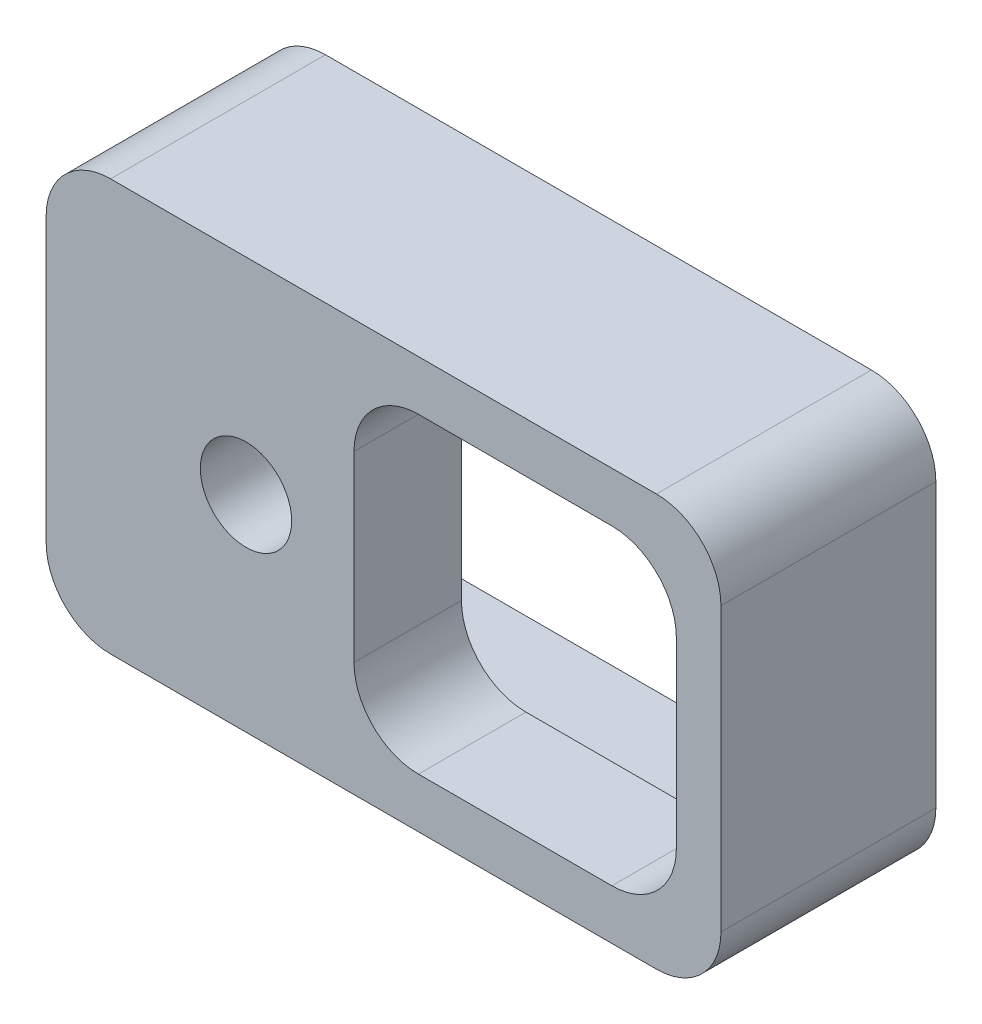
ISO-10303-21;
HEADER;
FILE_DESCRIPTION(('STEP AP214'),'2;1');
FILE_NAME('part.step','',(''),(''),'','','');
FILE_SCHEMA(('AUTOMOTIVE_DESIGN { 1 0 10303 214 1 1 1 1 }'));
ENDSEC;
DATA;
#1=APPLICATION_CONTEXT('core data for automotive mechanical design processes');
#2=APPLICATION_PROTOCOL_DEFINITION('international standard','automotive_design',2000,#1);
#3=PRODUCT_CONTEXT('',#1,'mechanical');
#4=PRODUCT('Part','Part','',(#3));
#5=PRODUCT_RELATED_PRODUCT_CATEGORY('part','',(#4));
#6=PRODUCT_DEFINITION_FORMATION('','',#4);
#7=PRODUCT_DEFINITION_CONTEXT('part definition',#1,'design');
#8=PRODUCT_DEFINITION('design','',#6,#7);
#9=PRODUCT_DEFINITION_SHAPE('','',#8);
#10=(LENGTH_UNIT() NAMED_UNIT(*) SI_UNIT(.MILLI.,.METRE.));
#11=(NAMED_UNIT(*) PLANE_ANGLE_UNIT() SI_UNIT($,.RADIAN.));
#12=(NAMED_UNIT(*) SI_UNIT($,.STERADIAN.) SOLID_ANGLE_UNIT());
#13=UNCERTAINTY_MEASURE_WITH_UNIT(LENGTH_MEASURE(1.E-05),#10,'distance_accuracy_value','');
#14=(GEOMETRIC_REPRESENTATION_CONTEXT(3) GLOBAL_UNCERTAINTY_ASSIGNED_CONTEXT((#13)) GLOBAL_UNIT_ASSIGNED_CONTEXT((#10,
#11,#12)) REPRESENTATION_CONTEXT('',''));
#15=CARTESIAN_POINT('',(0.,0.,0.));
#16=DIRECTION('',(0.,0.,1.));
#17=DIRECTION('',(1.,0.,0.));
#18=AXIS2_PLACEMENT_3D('',#15,#16,#17);
#19=CARTESIAN_POINT('',(0.,-2.25000000000001,10.));
#20=DIRECTION('',(0.,1.,0.));
#21=DIRECTION('',(0.,0.,1.));
#22=AXIS2_PLACEMENT_3D('',#19,#20,#21);
#23=PLANE('',#22);
#24=DIRECTION('',(1.,0.,0.));
#25=VECTOR('',#24,1.);
#26=CARTESIAN_POINT('',(0.,-2.25000000000001,10.));
#27=LINE('',#26,#25);
#28=CARTESIAN_POINT('',(32.25,-2.25000000000001,10.));
#29=VERTEX_POINT('',#28);
#30=CARTESIAN_POINT('',(50.25,-2.25000000000001,10.));
#31=VERTEX_POINT('',#30);
#32=EDGE_CURVE('E332',#29,#31,#27,.T.);
#33=ORIENTED_EDGE('',*,*,#32,.F.);
#34=DIRECTION('',(0.,0.,-1.));
#35=VECTOR('',#34,1.);
#36=CARTESIAN_POINT('',(32.25,-2.25000000000001,10.));
#37=LINE('',#36,#35);
#38=CARTESIAN_POINT('',(32.25,-2.25000000000001,0.));
#39=VERTEX_POINT('',#38);
#40=EDGE_CURVE('E313',#29,#39,#37,.T.);
#41=ORIENTED_EDGE('',*,*,#40,.T.);
#42=DIRECTION('',(1.,0.,0.));
#43=VECTOR('',#42,1.);
#44=CARTESIAN_POINT('',(0.,-2.25000000000001,0.));
#45=LINE('',#44,#43);
#46=CARTESIAN_POINT('',(50.25,-2.25000000000001,0.));
#47=VERTEX_POINT('',#46);
#48=EDGE_CURVE('E432',#39,#47,#45,.T.);
#49=ORIENTED_EDGE('',*,*,#48,.T.);
#50=DIRECTION('',(0.,0.,-1.));
#51=VECTOR('',#50,1.);
#52=CARTESIAN_POINT('',(50.25,-2.25000000000001,10.));
#53=LINE('',#52,#51);
#54=EDGE_CURVE('E311',#47,#31,#53,.F.);
#55=ORIENTED_EDGE('',*,*,#54,.T.);
#56=EDGE_LOOP('',(#33,#41,#49,#55));
#57=FACE_BOUND('',#56,.T.);
#58=ADVANCED_FACE('F38',(#57),#23,.F.);
#59=CARTESIAN_POINT('',(56.25,0.,10.));
#60=DIRECTION('',(1.,0.,0.));
#61=DIRECTION('',(0.,1.,0.));
#62=AXIS2_PLACEMENT_3D('',#59,#60,#61);
#63=PLANE('',#62);
#64=DIRECTION('',(0.,-1.,0.));
#65=VECTOR('',#64,1.);
#66=CARTESIAN_POINT('',(56.25,0.,0.));
#67=LINE('',#66,#65);
#68=CARTESIAN_POINT('',(56.25,-8.25,0.));
#69=VERTEX_POINT('',#68);
#70=CARTESIAN_POINT('',(56.25,-25.25,0.));
#71=VERTEX_POINT('',#70);
#72=EDGE_CURVE('E434',#69,#71,#67,.T.);
#73=ORIENTED_EDGE('',*,*,#72,.T.);
#74=DIRECTION('',(0.,0.,-1.));
#75=VECTOR('',#74,1.);
#76=CARTESIAN_POINT('',(56.25,-25.25,10.));
#77=LINE('',#76,#75);
#78=CARTESIAN_POINT('',(56.25,-25.25,10.));
#79=VERTEX_POINT('',#78);
#80=EDGE_CURVE('E304',#71,#79,#77,.F.);
#81=ORIENTED_EDGE('',*,*,#80,.T.);
#82=DIRECTION('',(0.,-1.,0.));
#83=VECTOR('',#82,1.);
#84=CARTESIAN_POINT('',(56.25,0.,10.));
#85=LINE('',#84,#83);
#86=CARTESIAN_POINT('',(56.25,-8.25,10.));
#87=VERTEX_POINT('',#86);
#88=EDGE_CURVE('E337',#87,#79,#85,.T.);
#89=ORIENTED_EDGE('',*,*,#88,.F.);
#90=DIRECTION('',(0.,0.,-1.));
#91=VECTOR('',#90,1.);
#92=CARTESIAN_POINT('',(56.25,-8.25,0.));
#93=LINE('',#92,#91);
#94=EDGE_CURVE('E301',#87,#69,#93,.T.);
#95=ORIENTED_EDGE('',*,*,#94,.T.);
#96=EDGE_LOOP('',(#73,#81,#89,#95));
#97=FACE_BOUND('',#96,.T.);
#98=ADVANCED_FACE('F352',(#97),#63,.F.);
#99=CARTESIAN_POINT('',(0.,-31.25,10.));
#100=DIRECTION('',(0.,1.,0.));
#101=DIRECTION('',(0.,0.,1.));
#102=AXIS2_PLACEMENT_3D('',#99,#100,#101);
#103=PLANE('',#102);
#104=DIRECTION('',(1.,0.,0.));
#105=VECTOR('',#104,1.);
#106=CARTESIAN_POINT('',(0.,-31.25,10.));
#107=LINE('',#106,#105);
#108=CARTESIAN_POINT('',(32.25,-31.25,10.));
#109=VERTEX_POINT('',#108);
#110=CARTESIAN_POINT('',(50.25,-31.25,10.));
#111=VERTEX_POINT('',#110);
#112=EDGE_CURVE('E421',#109,#111,#107,.T.);
#113=ORIENTED_EDGE('',*,*,#112,.T.);
#114=DIRECTION('',(0.,0.,-1.));
#115=VECTOR('',#114,1.);
#116=CARTESIAN_POINT('',(50.25,-31.25,10.));
#117=LINE('',#116,#115);
#118=CARTESIAN_POINT('',(50.25,-31.25,0.));
#119=VERTEX_POINT('',#118);
#120=EDGE_CURVE('E298',#111,#119,#117,.T.);
#121=ORIENTED_EDGE('',*,*,#120,.T.);
#122=DIRECTION('',(1.,0.,0.));
#123=VECTOR('',#122,1.);
#124=CARTESIAN_POINT('',(0.,-31.25,0.));
#125=LINE('',#124,#123);
#126=CARTESIAN_POINT('',(32.25,-31.25,0.));
#127=VERTEX_POINT('',#126);
#128=EDGE_CURVE('E438',#127,#119,#125,.T.);
#129=ORIENTED_EDGE('',*,*,#128,.F.);
#130=DIRECTION('',(0.,0.,-1.));
#131=VECTOR('',#130,1.);
#132=CARTESIAN_POINT('',(32.25,-31.25,10.));
#133=LINE('',#132,#131);
#134=EDGE_CURVE('E296',#127,#109,#133,.F.);
#135=ORIENTED_EDGE('',*,*,#134,.T.);
#136=EDGE_LOOP('',(#113,#121,#129,#135));
#137=FACE_BOUND('',#136,.T.);
#138=ADVANCED_FACE('F357',(#137),#103,.T.);
#139=CARTESIAN_POINT('',(60.4,0.,10.));
#140=DIRECTION('',(1.,0.,0.));
#141=DIRECTION('',(0.,1.,0.));
#142=AXIS2_PLACEMENT_3D('',#139,#140,#141);
#143=PLANE('',#142);
#144=DIRECTION('',(0.,-1.,0.));
#145=VECTOR('',#144,1.);
#146=CARTESIAN_POINT('',(60.4,0.,10.));
#147=LINE('',#146,#145);
#148=CARTESIAN_POINT('',(60.4,-3.6,10.));
#149=VERTEX_POINT('',#148);
#150=CARTESIAN_POINT('',(60.4,-29.9,10.));
#151=VERTEX_POINT('',#150);
#152=EDGE_CURVE('E441',#149,#151,#147,.T.);
#153=ORIENTED_EDGE('',*,*,#152,.T.);
#154=DIRECTION('',(0.,0.,-1.));
#155=VECTOR('',#154,1.);
#156=CARTESIAN_POINT('',(60.4,-29.9,-10.));
#157=LINE('',#156,#155);
#158=CARTESIAN_POINT('',(60.4,-29.9,-10.));
#159=VERTEX_POINT('',#158);
#160=EDGE_CURVE('E262',#151,#159,#157,.T.);
#161=ORIENTED_EDGE('',*,*,#160,.T.);
#162=DIRECTION('',(0.,-1.,0.));
#163=VECTOR('',#162,1.);
#164=CARTESIAN_POINT('',(60.4,0.,-10.));
#165=LINE('',#164,#163);
#166=CARTESIAN_POINT('',(60.4,-3.6,-10.));
#167=VERTEX_POINT('',#166);
#168=EDGE_CURVE('E466',#167,#159,#165,.T.);
#169=ORIENTED_EDGE('',*,*,#168,.F.);
#170=DIRECTION('',(0.,0.,-1.));
#171=VECTOR('',#170,1.);
#172=CARTESIAN_POINT('',(60.4,-3.6,10.));
#173=LINE('',#172,#171);
#174=EDGE_CURVE('E260',#167,#149,#173,.F.);
#175=ORIENTED_EDGE('',*,*,#174,.T.);
#176=EDGE_LOOP('',(#153,#161,#169,#175));
#177=FACE_BOUND('',#176,.T.);
#178=ADVANCED_FACE('F375',(#177),#143,.T.);
#179=CARTESIAN_POINT('',(0.,2.4,10.));
#180=DIRECTION('',(0.,1.,0.));
#181=DIRECTION('',(0.,0.,1.));
#182=AXIS2_PLACEMENT_3D('',#179,#180,#181);
#183=PLANE('',#182);
#184=DIRECTION('',(1.,0.,0.));
#185=VECTOR('',#184,1.);
#186=CARTESIAN_POINT('',(0.,2.4,-10.));
#187=LINE('',#186,#185);
#188=CARTESIAN_POINT('',(3.6,2.4,-10.));
#189=VERTEX_POINT('',#188);
#190=CARTESIAN_POINT('',(54.4,2.4,-10.));
#191=VERTEX_POINT('',#190);
#192=EDGE_CURVE('E474',#189,#191,#187,.T.);
#193=ORIENTED_EDGE('',*,*,#192,.F.);
#194=DIRECTION('',(0.,0.,-1.));
#195=VECTOR('',#194,1.);
#196=CARTESIAN_POINT('',(3.6,2.4,10.));
#197=LINE('',#196,#195);
#198=CARTESIAN_POINT('',(3.6,2.4,10.));
#199=VERTEX_POINT('',#198);
#200=EDGE_CURVE('E294',#189,#199,#197,.F.);
#201=ORIENTED_EDGE('',*,*,#200,.T.);
#202=DIRECTION('',(1.,0.,0.));
#203=VECTOR('',#202,1.);
#204=CARTESIAN_POINT('',(0.,2.4,10.));
#205=LINE('',#204,#203);
#206=CARTESIAN_POINT('',(54.4,2.4,10.));
#207=VERTEX_POINT('',#206);
#208=EDGE_CURVE('E444',#199,#207,#205,.T.);
#209=ORIENTED_EDGE('',*,*,#208,.T.);
#210=DIRECTION('',(0.,0.,-1.));
#211=VECTOR('',#210,1.);
#212=CARTESIAN_POINT('',(54.4,2.4,10.));
#213=LINE('',#212,#211);
#214=EDGE_CURVE('E291',#207,#191,#213,.T.);
#215=ORIENTED_EDGE('',*,*,#214,.T.);
#216=EDGE_LOOP('',(#193,#201,#209,#215));
#217=FACE_BOUND('',#216,.T.);
#218=ADVANCED_FACE('F371',(#217),#183,.T.);
#219=CARTESIAN_POINT('',(-2.4,0.,10.));
#220=DIRECTION('',(1.,0.,0.));
#221=DIRECTION('',(0.,1.,0.));
#222=AXIS2_PLACEMENT_3D('',#219,#220,#221);
#223=PLANE('',#222);
#224=DIRECTION('',(0.,-1.,0.));
#225=VECTOR('',#224,1.);
#226=CARTESIAN_POINT('',(-2.4,0.,-10.));
#227=LINE('',#226,#225);
#228=CARTESIAN_POINT('',(-2.4,-3.6,-10.));
#229=VERTEX_POINT('',#228);
#230=CARTESIAN_POINT('',(-2.4,-29.9,-10.));
#231=VERTEX_POINT('',#230);
#232=EDGE_CURVE('E476',#229,#231,#227,.T.);
#233=ORIENTED_EDGE('',*,*,#232,.T.);
#234=DIRECTION('',(0.,0.,-1.));
#235=VECTOR('',#234,1.);
#236=CARTESIAN_POINT('',(-2.4,-29.9,10.));
#237=LINE('',#236,#235);
#238=CARTESIAN_POINT('',(-2.4,-29.9,10.));
#239=VERTEX_POINT('',#238);
#240=EDGE_CURVE('E289',#231,#239,#237,.F.);
#241=ORIENTED_EDGE('',*,*,#240,.T.);
#242=DIRECTION('',(0.,-1.,0.));
#243=VECTOR('',#242,1.);
#244=CARTESIAN_POINT('',(-2.4,0.,10.));
#245=LINE('',#244,#243);
#246=CARTESIAN_POINT('',(-2.4,-3.6,10.));
#247=VERTEX_POINT('',#246);
#248=EDGE_CURVE('E449',#247,#239,#245,.T.);
#249=ORIENTED_EDGE('',*,*,#248,.F.);
#250=DIRECTION('',(0.,0.,-1.));
#251=VECTOR('',#250,1.);
#252=CARTESIAN_POINT('',(-2.4,-3.6,-10.));
#253=LINE('',#252,#251);
#254=EDGE_CURVE('E286',#247,#229,#253,.T.);
#255=ORIENTED_EDGE('',*,*,#254,.T.);
#256=EDGE_LOOP('',(#233,#241,#249,#255));
#257=FACE_BOUND('',#256,.T.);
#258=ADVANCED_FACE('F368',(#257),#223,.F.);
#259=CARTESIAN_POINT('',(26.25,0.,10.));
#260=DIRECTION('',(1.,0.,0.));
#261=DIRECTION('',(0.,1.,0.));
#262=AXIS2_PLACEMENT_3D('',#259,#260,#261);
#263=PLANE('',#262);
#264=DIRECTION('',(0.,-1.,0.));
#265=VECTOR('',#264,1.);
#266=CARTESIAN_POINT('',(26.25,0.,10.));
#267=LINE('',#266,#265);
#268=CARTESIAN_POINT('',(26.25,-8.25000000000001,10.));
#269=VERTEX_POINT('',#268);
#270=CARTESIAN_POINT('',(26.25,-25.25,10.));
#271=VERTEX_POINT('',#270);
#272=EDGE_CURVE('E228',#269,#271,#267,.T.);
#273=ORIENTED_EDGE('',*,*,#272,.T.);
#274=DIRECTION('',(0.,0.,-1.));
#275=VECTOR('',#274,1.);
#276=CARTESIAN_POINT('',(26.25,-25.25,0.));
#277=LINE('',#276,#275);
#278=CARTESIAN_POINT('',(26.25,-25.25,0.));
#279=VERTEX_POINT('',#278);
#280=EDGE_CURVE('E308',#271,#279,#277,.T.);
#281=ORIENTED_EDGE('',*,*,#280,.T.);
#282=DIRECTION('',(0.,-1.,0.));
#283=VECTOR('',#282,1.);
#284=CARTESIAN_POINT('',(26.25,0.,0.));
#285=LINE('',#284,#283);
#286=CARTESIAN_POINT('',(26.25,-8.25000000000001,0.));
#287=VERTEX_POINT('',#286);
#288=EDGE_CURVE('E439',#287,#279,#285,.T.);
#289=ORIENTED_EDGE('',*,*,#288,.F.);
#290=DIRECTION('',(0.,0.,-1.));
#291=VECTOR('',#290,1.);
#292=CARTESIAN_POINT('',(26.25,-8.25000000000001,10.));
#293=LINE('',#292,#291);
#294=EDGE_CURVE('E306',#287,#269,#293,.F.);
#295=ORIENTED_EDGE('',*,*,#294,.T.);
#296=EDGE_LOOP('',(#273,#281,#289,#295));
#297=FACE_BOUND('',#296,.T.);
#298=ADVANCED_FACE('F366',(#297),#263,.T.);
#299=CARTESIAN_POINT('',(0.,-35.9,10.));
#300=DIRECTION('',(0.,1.,0.));
#301=DIRECTION('',(0.,0.,1.));
#302=AXIS2_PLACEMENT_3D('',#299,#300,#301);
#303=PLANE('',#302);
#304=DIRECTION('',(1.,0.,0.));
#305=VECTOR('',#304,1.);
#306=CARTESIAN_POINT('',(0.,-35.9,-10.));
#307=LINE('',#306,#305);
#308=CARTESIAN_POINT('',(3.6,-35.9,-10.));
#309=VERTEX_POINT('',#308);
#310=CARTESIAN_POINT('',(54.4,-35.9,-10.));
#311=VERTEX_POINT('',#310);
#312=EDGE_CURVE('E485',#309,#311,#307,.T.);
#313=ORIENTED_EDGE('',*,*,#312,.T.);
#314=DIRECTION('',(0.,0.,-1.));
#315=VECTOR('',#314,1.);
#316=CARTESIAN_POINT('',(54.4,-35.9,10.));
#317=LINE('',#316,#315);
#318=CARTESIAN_POINT('',(54.4,-35.9,10.));
#319=VERTEX_POINT('',#318);
#320=EDGE_CURVE('E276',#311,#319,#317,.F.);
#321=ORIENTED_EDGE('',*,*,#320,.T.);
#322=DIRECTION('',(1.,0.,0.));
#323=VECTOR('',#322,1.);
#324=CARTESIAN_POINT('',(0.,-35.9,10.));
#325=LINE('',#324,#323);
#326=CARTESIAN_POINT('',(3.6,-35.9,10.));
#327=VERTEX_POINT('',#326);
#328=EDGE_CURVE('E338',#327,#319,#325,.T.);
#329=ORIENTED_EDGE('',*,*,#328,.F.);
#330=DIRECTION('',(0.,0.,-1.));
#331=VECTOR('',#330,1.);
#332=CARTESIAN_POINT('',(3.6,-35.9,10.));
#333=LINE('',#332,#331);
#334=EDGE_CURVE('E273',#327,#309,#333,.T.);
#335=ORIENTED_EDGE('',*,*,#334,.T.);
#336=EDGE_LOOP('',(#313,#321,#329,#335));
#337=FACE_BOUND('',#336,.T.);
#338=ADVANCED_FACE('F362',(#337),#303,.F.);
#339=CARTESIAN_POINT('',(16.2,-16.75,10.));
#340=DIRECTION('',(0.,0.,-1.));
#341=DIRECTION('',(-1.,0.,0.));
#342=AXIS2_PLACEMENT_3D('',#339,#340,#341);
#343=CYLINDRICAL_SURFACE('',#342,4.25);
#344=CARTESIAN_POINT('',(16.2,-16.75,3.));
#345=DIRECTION('',(0.,0.,1.));
#346=DIRECTION('',(1.,0.,0.));
#347=AXIS2_PLACEMENT_3D('',#344,#345,#346);
#348=CIRCLE('',#347,4.25);
#349=CARTESIAN_POINT('',(20.45,-16.75,3.));
#350=VERTEX_POINT('',#349);
#351=EDGE_CURVE('E231',#350,#350,#348,.T.);
#352=ORIENTED_EDGE('',*,*,#351,.F.);
#353=EDGE_LOOP('',(#352));
#354=FACE_BOUND('',#353,.T.);
#355=CARTESIAN_POINT('',(16.2,-16.75,10.));
#356=DIRECTION('',(0.,0.,1.));
#357=DIRECTION('',(1.,0.,0.));
#358=AXIS2_PLACEMENT_3D('',#355,#356,#357);
#359=CIRCLE('',#358,4.25);
#360=CARTESIAN_POINT('',(20.45,-16.75,10.));
#361=VERTEX_POINT('',#360);
#362=EDGE_CURVE('E224',#361,#361,#359,.T.);
#363=ORIENTED_EDGE('',*,*,#362,.T.);
#364=EDGE_LOOP('',(#363));
#365=FACE_BOUND('',#364,.T.);
#366=ADVANCED_FACE('F365',(#354,#365),#343,.F.);
#367=CARTESIAN_POINT('',(0.,0.,10.));
#368=DIRECTION('',(0.,0.,1.));
#369=DIRECTION('',(1.,0.,0.));
#370=AXIS2_PLACEMENT_3D('',#367,#368,#369);
#371=PLANE('',#370);
#372=ORIENTED_EDGE('',*,*,#328,.T.);
#373=CARTESIAN_POINT('',(54.4,-29.9,10.));
#374=DIRECTION('',(0.,0.,1.));
#375=DIRECTION('',(1.,0.,0.));
#376=AXIS2_PLACEMENT_3D('',#373,#374,#375);
#377=CIRCLE('',#376,6.);
#378=EDGE_CURVE('E284',#319,#151,#377,.T.);
#379=ORIENTED_EDGE('',*,*,#378,.T.);
#380=ORIENTED_EDGE('',*,*,#152,.F.);
#381=CARTESIAN_POINT('',(54.4,-3.6,10.));
#382=DIRECTION('',(0.,0.,1.));
#383=DIRECTION('',(1.,0.,0.));
#384=AXIS2_PLACEMENT_3D('',#381,#382,#383);
#385=CIRCLE('',#384,6.);
#386=EDGE_CURVE('E278',#149,#207,#385,.T.);
#387=ORIENTED_EDGE('',*,*,#386,.T.);
#388=ORIENTED_EDGE('',*,*,#208,.F.);
#389=CARTESIAN_POINT('',(3.6,-3.6,10.));
#390=DIRECTION('',(0.,0.,1.));
#391=DIRECTION('',(1.,0.,0.));
#392=AXIS2_PLACEMENT_3D('',#389,#390,#391);
#393=CIRCLE('',#392,6.);
#394=EDGE_CURVE('E280',#199,#247,#393,.T.);
#395=ORIENTED_EDGE('',*,*,#394,.T.);
#396=ORIENTED_EDGE('',*,*,#248,.T.);
#397=CARTESIAN_POINT('',(3.6,-29.9,10.));
#398=DIRECTION('',(0.,0.,1.));
#399=DIRECTION('',(1.,0.,0.));
#400=AXIS2_PLACEMENT_3D('',#397,#398,#399);
#401=CIRCLE('',#400,6.);
#402=EDGE_CURVE('E282',#239,#327,#401,.T.);
#403=ORIENTED_EDGE('',*,*,#402,.T.);
#404=EDGE_LOOP('',(#372,#379,#380,#387,#388,#395,#396,#403));
#405=FACE_BOUND('',#404,.T.);
#406=ORIENTED_EDGE('',*,*,#272,.F.);
#407=CARTESIAN_POINT('',(32.25,-8.25000000000001,10.));
#408=DIRECTION('',(0.,0.,1.));
#409=DIRECTION('',(1.,0.,0.));
#410=AXIS2_PLACEMENT_3D('',#407,#408,#409);
#411=CIRCLE('',#410,6.);
#412=EDGE_CURVE('E324',#269,#29,#411,.F.);
#413=ORIENTED_EDGE('',*,*,#412,.T.);
#414=ORIENTED_EDGE('',*,*,#32,.T.);
#415=CARTESIAN_POINT('',(50.25,-8.25000000000001,10.));
#416=DIRECTION('',(0.,0.,1.));
#417=DIRECTION('',(1.,0.,0.));
#418=AXIS2_PLACEMENT_3D('',#415,#416,#417);
#419=CIRCLE('',#418,6.);
#420=EDGE_CURVE('E11',#31,#87,#419,.F.);
#421=ORIENTED_EDGE('',*,*,#420,.T.);
#422=ORIENTED_EDGE('',*,*,#88,.T.);
#423=CARTESIAN_POINT('',(50.25,-25.25,10.));
#424=DIRECTION('',(0.,0.,1.));
#425=DIRECTION('',(1.,0.,0.));
#426=AXIS2_PLACEMENT_3D('',#423,#424,#425);
#427=CIRCLE('',#426,6.);
#428=EDGE_CURVE('E317',#79,#111,#427,.F.);
#429=ORIENTED_EDGE('',*,*,#428,.T.);
#430=ORIENTED_EDGE('',*,*,#112,.F.);
#431=CARTESIAN_POINT('',(32.25,-25.25,10.));
#432=DIRECTION('',(0.,0.,1.));
#433=DIRECTION('',(1.,0.,0.));
#434=AXIS2_PLACEMENT_3D('',#431,#432,#433);
#435=CIRCLE('',#434,6.);
#436=EDGE_CURVE('E321',#109,#271,#435,.F.);
#437=ORIENTED_EDGE('',*,*,#436,.T.);
#438=EDGE_LOOP('',(#406,#413,#414,#421,#422,#429,#430,#437));
#439=FACE_BOUND('',#438,.T.);
#440=ORIENTED_EDGE('',*,*,#362,.F.);
#441=EDGE_LOOP('',(#440));
#442=FACE_BOUND('',#441,.T.);
#443=ADVANCED_FACE('F330',(#405,#439,#442),#371,.T.);
#444=CARTESIAN_POINT('',(0.,0.,0.));
#445=DIRECTION('',(0.,0.,1.));
#446=DIRECTION('',(1.,0.,0.));
#447=AXIS2_PLACEMENT_3D('',#444,#445,#446);
#448=PLANE('',#447);
#449=CARTESIAN_POINT('',(14.45,-16.75,0.));
#450=DIRECTION('',(0.,0.,1.));
#451=DIRECTION('',(1.,0.,0.));
#452=AXIS2_PLACEMENT_3D('',#449,#450,#451);
#453=CIRCLE('',#452,6.5);
#454=CARTESIAN_POINT('',(20.95,-16.75,0.));
#455=VERTEX_POINT('',#454);
#456=EDGE_CURVE('E480',#455,#455,#453,.T.);
#457=ORIENTED_EDGE('',*,*,#456,.T.);
#458=EDGE_LOOP('',(#457));
#459=FACE_BOUND('',#458,.T.);
#460=DIRECTION('',(0.,-1.,0.));
#461=VECTOR('',#460,1.);
#462=CARTESIAN_POINT('',(58.,0.,0.));
#463=LINE('',#462,#461);
#464=CARTESIAN_POINT('',(58.,-3.6,0.));
#465=VERTEX_POINT('',#464);
#466=CARTESIAN_POINT('',(58.,-29.9,0.));
#467=VERTEX_POINT('',#466);
#468=EDGE_CURVE('E202',#465,#467,#463,.T.);
#469=ORIENTED_EDGE('',*,*,#468,.T.);
#470=CARTESIAN_POINT('',(54.4,-29.9,0.));
#471=DIRECTION('',(0.,0.,1.));
#472=DIRECTION('',(1.,0.,0.));
#473=AXIS2_PLACEMENT_3D('',#470,#471,#472);
#474=CIRCLE('',#473,3.6);
#475=CARTESIAN_POINT('',(54.4,-33.5,0.));
#476=VERTEX_POINT('',#475);
#477=EDGE_CURVE('E237',#467,#476,#474,.F.);
#478=ORIENTED_EDGE('',*,*,#477,.T.);
#479=DIRECTION('',(1.,0.,0.));
#480=VECTOR('',#479,1.);
#481=CARTESIAN_POINT('',(0.,-33.5,0.));
#482=LINE('',#481,#480);
#483=CARTESIAN_POINT('',(3.6,-33.5,0.));
#484=VERTEX_POINT('',#483);
#485=EDGE_CURVE('E219',#484,#476,#482,.T.);
#486=ORIENTED_EDGE('',*,*,#485,.F.);
#487=CARTESIAN_POINT('',(3.6,-29.9,0.));
#488=DIRECTION('',(0.,0.,1.));
#489=DIRECTION('',(1.,0.,0.));
#490=AXIS2_PLACEMENT_3D('',#487,#488,#489);
#491=CIRCLE('',#490,3.6);
#492=CARTESIAN_POINT('',(0.,-29.9,0.));
#493=VERTEX_POINT('',#492);
#494=EDGE_CURVE('E235',#484,#493,#491,.F.);
#495=ORIENTED_EDGE('',*,*,#494,.T.);
#496=DIRECTION('',(0.,-1.,0.));
#497=VECTOR('',#496,1.);
#498=CARTESIAN_POINT('',(0.,0.,0.));
#499=LINE('',#498,#497);
#500=CARTESIAN_POINT('',(0.,-3.6,0.));
#501=VERTEX_POINT('',#500);
#502=EDGE_CURVE('E452',#501,#493,#499,.T.);
#503=ORIENTED_EDGE('',*,*,#502,.F.);
#504=CARTESIAN_POINT('',(3.6,-3.6,0.));
#505=DIRECTION('',(0.,0.,1.));
#506=DIRECTION('',(1.,0.,0.));
#507=AXIS2_PLACEMENT_3D('',#504,#505,#506);
#508=CIRCLE('',#507,3.6);
#509=CARTESIAN_POINT('',(3.6,0.,0.));
#510=VERTEX_POINT('',#509);
#511=EDGE_CURVE('E209',#501,#510,#508,.F.);
#512=ORIENTED_EDGE('',*,*,#511,.T.);
#513=DIRECTION('',(1.,0.,0.));
#514=VECTOR('',#513,1.);
#515=CARTESIAN_POINT('',(0.,0.,0.));
#516=LINE('',#515,#514);
#517=CARTESIAN_POINT('',(54.4,0.,0.));
#518=VERTEX_POINT('',#517);
#519=EDGE_CURVE('E204',#510,#518,#516,.T.);
#520=ORIENTED_EDGE('',*,*,#519,.T.);
#521=CARTESIAN_POINT('',(54.4,-3.6,0.));
#522=DIRECTION('',(0.,0.,1.));
#523=DIRECTION('',(1.,0.,0.));
#524=AXIS2_PLACEMENT_3D('',#521,#522,#523);
#525=CIRCLE('',#524,3.6);
#526=EDGE_CURVE('E199',#518,#465,#525,.F.);
#527=ORIENTED_EDGE('',*,*,#526,.T.);
#528=EDGE_LOOP('',(#469,#478,#486,#495,#503,#512,#520,#527));
#529=FACE_BOUND('',#528,.T.);
#530=ORIENTED_EDGE('',*,*,#48,.F.);
#531=CARTESIAN_POINT('',(32.25,-8.25000000000001,0.));
#532=DIRECTION('',(0.,0.,1.));
#533=DIRECTION('',(1.,0.,0.));
#534=AXIS2_PLACEMENT_3D('',#531,#532,#533);
#535=CIRCLE('',#534,6.);
#536=EDGE_CURVE('E60',#39,#287,#535,.T.);
#537=ORIENTED_EDGE('',*,*,#536,.T.);
#538=ORIENTED_EDGE('',*,*,#288,.T.);
#539=CARTESIAN_POINT('',(32.25,-25.25,0.));
#540=DIRECTION('',(0.,0.,1.));
#541=DIRECTION('',(1.,0.,0.));
#542=AXIS2_PLACEMENT_3D('',#539,#540,#541);
#543=CIRCLE('',#542,6.);
#544=EDGE_CURVE('E319',#279,#127,#543,.T.);
#545=ORIENTED_EDGE('',*,*,#544,.T.);
#546=ORIENTED_EDGE('',*,*,#128,.T.);
#547=CARTESIAN_POINT('',(50.25,-25.25,0.));
#548=DIRECTION('',(0.,0.,1.));
#549=DIRECTION('',(1.,0.,0.));
#550=AXIS2_PLACEMENT_3D('',#547,#548,#549);
#551=CIRCLE('',#550,6.);
#552=EDGE_CURVE('E315',#119,#71,#551,.T.);
#553=ORIENTED_EDGE('',*,*,#552,.T.);
#554=ORIENTED_EDGE('',*,*,#72,.F.);
#555=CARTESIAN_POINT('',(50.25,-8.25000000000001,0.));
#556=DIRECTION('',(0.,0.,1.));
#557=DIRECTION('',(1.,0.,0.));
#558=AXIS2_PLACEMENT_3D('',#555,#556,#557);
#559=CIRCLE('',#558,6.);
#560=EDGE_CURVE('E46',#69,#47,#559,.T.);
#561=ORIENTED_EDGE('',*,*,#560,.T.);
#562=EDGE_LOOP('',(#530,#537,#538,#545,#546,#553,#554,#561));
#563=FACE_BOUND('',#562,.T.);
#564=ADVANCED_FACE('F201',(#459,#529,#563),#448,.F.);
#565=CARTESIAN_POINT('',(0.,0.,-10.));
#566=DIRECTION('',(0.,-1.,0.));
#567=DIRECTION('',(0.,0.,-1.));
#568=AXIS2_PLACEMENT_3D('',#565,#566,#567);
#569=PLANE('',#568);
#570=ORIENTED_EDGE('',*,*,#519,.F.);
#571=DIRECTION('',(0.,0.,1.));
#572=VECTOR('',#571,1.);
#573=CARTESIAN_POINT('',(3.6,0.,-10.));
#574=LINE('',#573,#572);
#575=CARTESIAN_POINT('',(3.6,0.,-10.));
#576=VERTEX_POINT('',#575);
#577=EDGE_CURVE('E251',#510,#576,#574,.F.);
#578=ORIENTED_EDGE('',*,*,#577,.T.);
#579=DIRECTION('',(1.,0.,0.));
#580=VECTOR('',#579,1.);
#581=CARTESIAN_POINT('',(0.,0.,-10.));
#582=LINE('',#581,#580);
#583=CARTESIAN_POINT('',(54.4,0.,-10.));
#584=VERTEX_POINT('',#583);
#585=EDGE_CURVE('E487',#576,#584,#582,.T.);
#586=ORIENTED_EDGE('',*,*,#585,.T.);
#587=DIRECTION('',(0.,0.,1.));
#588=VECTOR('',#587,1.);
#589=CARTESIAN_POINT('',(54.4,0.,0.));
#590=LINE('',#589,#588);
#591=EDGE_CURVE('E249',#584,#518,#590,.T.);
#592=ORIENTED_EDGE('',*,*,#591,.T.);
#593=EDGE_LOOP('',(#570,#578,#586,#592));
#594=FACE_BOUND('',#593,.T.);
#595=ADVANCED_FACE('F516',(#594),#569,.T.);
#596=CARTESIAN_POINT('',(0.,0.,-10.));
#597=DIRECTION('',(-1.,0.,0.));
#598=DIRECTION('',(0.,-1.,0.));
#599=AXIS2_PLACEMENT_3D('',#596,#597,#598);
#600=PLANE('',#599);
#601=ORIENTED_EDGE('',*,*,#502,.T.);
#602=DIRECTION('',(0.,0.,1.));
#603=VECTOR('',#602,1.);
#604=CARTESIAN_POINT('',(0.,-29.9,-10.));
#605=LINE('',#604,#603);
#606=CARTESIAN_POINT('',(0.,-29.9,-10.));
#607=VERTEX_POINT('',#606);
#608=EDGE_CURVE('E247',#493,#607,#605,.F.);
#609=ORIENTED_EDGE('',*,*,#608,.T.);
#610=DIRECTION('',(0.,-1.,0.));
#611=VECTOR('',#610,1.);
#612=CARTESIAN_POINT('',(0.,0.,-10.));
#613=LINE('',#612,#611);
#614=CARTESIAN_POINT('',(0.,-3.6,-10.));
#615=VERTEX_POINT('',#614);
#616=EDGE_CURVE('E435',#615,#607,#613,.T.);
#617=ORIENTED_EDGE('',*,*,#616,.F.);
#618=DIRECTION('',(0.,0.,1.));
#619=VECTOR('',#618,1.);
#620=CARTESIAN_POINT('',(0.,-3.6,-10.));
#621=LINE('',#620,#619);
#622=EDGE_CURVE('E244',#615,#501,#621,.T.);
#623=ORIENTED_EDGE('',*,*,#622,.T.);
#624=EDGE_LOOP('',(#601,#609,#617,#623));
#625=FACE_BOUND('',#624,.T.);
#626=ADVANCED_FACE('F510',(#625),#600,.F.);
#627=CARTESIAN_POINT('',(0.,-33.5,-10.));
#628=DIRECTION('',(0.,-1.,0.));
#629=DIRECTION('',(0.,0.,-1.));
#630=AXIS2_PLACEMENT_3D('',#627,#628,#629);
#631=PLANE('',#630);
#632=ORIENTED_EDGE('',*,*,#485,.T.);
#633=DIRECTION('',(0.,0.,1.));
#634=VECTOR('',#633,1.);
#635=CARTESIAN_POINT('',(54.4,-33.5,-10.));
#636=LINE('',#635,#634);
#637=CARTESIAN_POINT('',(54.4,-33.5,-10.));
#638=VERTEX_POINT('',#637);
#639=EDGE_CURVE('E242',#476,#638,#636,.F.);
#640=ORIENTED_EDGE('',*,*,#639,.T.);
#641=DIRECTION('',(1.,0.,0.));
#642=VECTOR('',#641,1.);
#643=CARTESIAN_POINT('',(0.,-33.5,-10.));
#644=LINE('',#643,#642);
#645=CARTESIAN_POINT('',(3.6,-33.5,-10.));
#646=VERTEX_POINT('',#645);
#647=EDGE_CURVE('E492',#646,#638,#644,.T.);
#648=ORIENTED_EDGE('',*,*,#647,.F.);
#649=DIRECTION('',(0.,0.,1.));
#650=VECTOR('',#649,1.);
#651=CARTESIAN_POINT('',(3.6,-33.5,0.));
#652=LINE('',#651,#650);
#653=EDGE_CURVE('E239',#646,#484,#652,.T.);
#654=ORIENTED_EDGE('',*,*,#653,.T.);
#655=EDGE_LOOP('',(#632,#640,#648,#654));
#656=FACE_BOUND('',#655,.T.);
#657=ADVANCED_FACE('F501',(#656),#631,.F.);
#658=CARTESIAN_POINT('',(58.,0.,-10.));
#659=DIRECTION('',(-1.,0.,0.));
#660=DIRECTION('',(0.,-1.,0.));
#661=AXIS2_PLACEMENT_3D('',#658,#659,#660);
#662=PLANE('',#661);
#663=DIRECTION('',(0.,-1.,0.));
#664=VECTOR('',#663,1.);
#665=CARTESIAN_POINT('',(58.,0.,-10.));
#666=LINE('',#665,#664);
#667=CARTESIAN_POINT('',(58.,-3.6,-10.));
#668=VERTEX_POINT('',#667);
#669=CARTESIAN_POINT('',(58.,-29.9,-10.));
#670=VERTEX_POINT('',#669);
#671=EDGE_CURVE('E490',#668,#670,#666,.T.);
#672=ORIENTED_EDGE('',*,*,#671,.T.);
#673=DIRECTION('',(0.,0.,1.));
#674=VECTOR('',#673,1.);
#675=CARTESIAN_POINT('',(58.,-29.9,-10.));
#676=LINE('',#675,#674);
#677=EDGE_CURVE('E210',#670,#467,#676,.T.);
#678=ORIENTED_EDGE('',*,*,#677,.T.);
#679=ORIENTED_EDGE('',*,*,#468,.F.);
#680=DIRECTION('',(0.,0.,1.));
#681=VECTOR('',#680,1.);
#682=CARTESIAN_POINT('',(58.,-3.6,-10.));
#683=LINE('',#682,#681);
#684=EDGE_CURVE('E216',#465,#668,#683,.F.);
#685=ORIENTED_EDGE('',*,*,#684,.T.);
#686=EDGE_LOOP('',(#672,#678,#679,#685));
#687=FACE_BOUND('',#686,.T.);
#688=ADVANCED_FACE('F215',(#687),#662,.T.);
#689=CARTESIAN_POINT('',(0.,0.,-10.));
#690=DIRECTION('',(0.,0.,1.));
#691=DIRECTION('',(1.,0.,0.));
#692=AXIS2_PLACEMENT_3D('',#689,#690,#691);
#693=PLANE('',#692);
#694=ORIENTED_EDGE('',*,*,#168,.T.);
#695=CARTESIAN_POINT('',(54.4,-29.9,-10.));
#696=DIRECTION('',(0.,0.,1.));
#697=DIRECTION('',(1.,0.,0.));
#698=AXIS2_PLACEMENT_3D('',#695,#696,#697);
#699=CIRCLE('',#698,6.);
#700=EDGE_CURVE('E271',#159,#311,#699,.F.);
#701=ORIENTED_EDGE('',*,*,#700,.T.);
#702=ORIENTED_EDGE('',*,*,#312,.F.);
#703=CARTESIAN_POINT('',(3.6,-29.9,-10.));
#704=DIRECTION('',(0.,0.,1.));
#705=DIRECTION('',(1.,0.,0.));
#706=AXIS2_PLACEMENT_3D('',#703,#704,#705);
#707=CIRCLE('',#706,6.);
#708=EDGE_CURVE('E269',#309,#231,#707,.F.);
#709=ORIENTED_EDGE('',*,*,#708,.T.);
#710=ORIENTED_EDGE('',*,*,#232,.F.);
#711=CARTESIAN_POINT('',(3.6,-3.6,-10.));
#712=DIRECTION('',(0.,0.,1.));
#713=DIRECTION('',(1.,0.,0.));
#714=AXIS2_PLACEMENT_3D('',#711,#712,#713);
#715=CIRCLE('',#714,6.);
#716=EDGE_CURVE('E267',#229,#189,#715,.F.);
#717=ORIENTED_EDGE('',*,*,#716,.T.);
#718=ORIENTED_EDGE('',*,*,#192,.T.);
#719=CARTESIAN_POINT('',(54.4,-3.6,-10.));
#720=DIRECTION('',(0.,0.,1.));
#721=DIRECTION('',(1.,0.,0.));
#722=AXIS2_PLACEMENT_3D('',#719,#720,#721);
#723=CIRCLE('',#722,6.);
#724=EDGE_CURVE('E265',#191,#167,#723,.F.);
#725=ORIENTED_EDGE('',*,*,#724,.T.);
#726=EDGE_LOOP('',(#694,#701,#702,#709,#710,#717,#718,#725));
#727=FACE_BOUND('',#726,.T.);
#728=ORIENTED_EDGE('',*,*,#585,.F.);
#729=CARTESIAN_POINT('',(3.6,-3.6,-10.));
#730=DIRECTION('',(0.,0.,1.));
#731=DIRECTION('',(1.,0.,0.));
#732=AXIS2_PLACEMENT_3D('',#729,#730,#731);
#733=CIRCLE('',#732,3.6);
#734=EDGE_CURVE('E257',#576,#615,#733,.T.);
#735=ORIENTED_EDGE('',*,*,#734,.T.);
#736=ORIENTED_EDGE('',*,*,#616,.T.);
#737=CARTESIAN_POINT('',(3.6,-29.9,-10.));
#738=DIRECTION('',(0.,0.,1.));
#739=DIRECTION('',(1.,0.,0.));
#740=AXIS2_PLACEMENT_3D('',#737,#738,#739);
#741=CIRCLE('',#740,3.6);
#742=EDGE_CURVE('E255',#607,#646,#741,.T.);
#743=ORIENTED_EDGE('',*,*,#742,.T.);
#744=ORIENTED_EDGE('',*,*,#647,.T.);
#745=CARTESIAN_POINT('',(54.4,-29.9,-10.));
#746=DIRECTION('',(0.,0.,1.));
#747=DIRECTION('',(1.,0.,0.));
#748=AXIS2_PLACEMENT_3D('',#745,#746,#747);
#749=CIRCLE('',#748,3.6);
#750=EDGE_CURVE('E253',#638,#670,#749,.T.);
#751=ORIENTED_EDGE('',*,*,#750,.T.);
#752=ORIENTED_EDGE('',*,*,#671,.F.);
#753=CARTESIAN_POINT('',(54.4,-3.6,-10.));
#754=DIRECTION('',(0.,0.,1.));
#755=DIRECTION('',(1.,0.,0.));
#756=AXIS2_PLACEMENT_3D('',#753,#754,#755);
#757=CIRCLE('',#756,3.6);
#758=EDGE_CURVE('E223',#668,#584,#757,.T.);
#759=ORIENTED_EDGE('',*,*,#758,.T.);
#760=EDGE_LOOP('',(#728,#735,#736,#743,#744,#751,#752,#759));
#761=FACE_BOUND('',#760,.T.);
#762=ADVANCED_FACE('F469',(#727,#761),#693,.F.);
#763=CARTESIAN_POINT('',(14.45,-16.75,3.));
#764=DIRECTION('',(0.,0.,-1.));
#765=DIRECTION('',(-1.,0.,0.));
#766=AXIS2_PLACEMENT_3D('',#763,#764,#765);
#767=CYLINDRICAL_SURFACE('',#766,6.5);
#768=CARTESIAN_POINT('',(14.45,-16.75,3.));
#769=DIRECTION('',(0.,0.,1.));
#770=DIRECTION('',(1.,0.,0.));
#771=AXIS2_PLACEMENT_3D('',#768,#769,#770);
#772=CIRCLE('',#771,6.5);
#773=CARTESIAN_POINT('',(20.95,-16.75,3.));
#774=VERTEX_POINT('',#773);
#775=EDGE_CURVE('E747',#774,#774,#772,.T.);
#776=ORIENTED_EDGE('',*,*,#775,.T.);
#777=EDGE_LOOP('',(#776));
#778=FACE_BOUND('',#777,.T.);
#779=ORIENTED_EDGE('',*,*,#456,.F.);
#780=EDGE_LOOP('',(#779));
#781=FACE_BOUND('',#780,.T.);
#782=ADVANCED_FACE('F584',(#778,#781),#767,.F.);
#783=CARTESIAN_POINT('',(14.45,-16.75,3.));
#784=DIRECTION('',(0.,0.,1.));
#785=DIRECTION('',(1.,0.,0.));
#786=AXIS2_PLACEMENT_3D('',#783,#784,#785);
#787=PLANE('',#786);
#788=ORIENTED_EDGE('',*,*,#351,.T.);
#789=EDGE_LOOP('',(#788));
#790=FACE_BOUND('',#789,.T.);
#791=ORIENTED_EDGE('',*,*,#775,.F.);
#792=EDGE_LOOP('',(#791));
#793=FACE_BOUND('',#792,.T.);
#794=ADVANCED_FACE('F384',(#790,#793),#787,.F.);
#795=CARTESIAN_POINT('',(54.4,-29.9,-10.));
#796=DIRECTION('',(0.,0.,1.));
#797=DIRECTION('',(1.,0.,0.));
#798=AXIS2_PLACEMENT_3D('',#795,#796,#797);
#799=CYLINDRICAL_SURFACE('',#798,3.6);
#800=ORIENTED_EDGE('',*,*,#750,.F.);
#801=ORIENTED_EDGE('',*,*,#639,.F.);
#802=ORIENTED_EDGE('',*,*,#477,.F.);
#803=ORIENTED_EDGE('',*,*,#677,.F.);
#804=EDGE_LOOP('',(#800,#801,#802,#803));
#805=FACE_BOUND('',#804,.T.);
#806=ADVANCED_FACE('F380',(#805),#799,.F.);
#807=CARTESIAN_POINT('',(3.6,-29.9,-10.));
#808=DIRECTION('',(0.,0.,-1.));
#809=DIRECTION('',(-1.,0.,0.));
#810=AXIS2_PLACEMENT_3D('',#807,#808,#809);
#811=CYLINDRICAL_SURFACE('',#810,3.6);
#812=ORIENTED_EDGE('',*,*,#742,.F.);
#813=ORIENTED_EDGE('',*,*,#608,.F.);
#814=ORIENTED_EDGE('',*,*,#494,.F.);
#815=ORIENTED_EDGE('',*,*,#653,.F.);
#816=EDGE_LOOP('',(#812,#813,#814,#815));
#817=FACE_BOUND('',#816,.T.);
#818=ADVANCED_FACE('F383',(#817),#811,.F.);
#819=CARTESIAN_POINT('',(3.6,-3.6,-10.));
#820=DIRECTION('',(0.,0.,1.));
#821=DIRECTION('',(1.,0.,0.));
#822=AXIS2_PLACEMENT_3D('',#819,#820,#821);
#823=CYLINDRICAL_SURFACE('',#822,3.6);
#824=ORIENTED_EDGE('',*,*,#734,.F.);
#825=ORIENTED_EDGE('',*,*,#577,.F.);
#826=ORIENTED_EDGE('',*,*,#511,.F.);
#827=ORIENTED_EDGE('',*,*,#622,.F.);
#828=EDGE_LOOP('',(#824,#825,#826,#827));
#829=FACE_BOUND('',#828,.T.);
#830=ADVANCED_FACE('F388',(#829),#823,.F.);
#831=CARTESIAN_POINT('',(54.4,-3.6,-10.));
#832=DIRECTION('',(0.,0.,-1.));
#833=DIRECTION('',(-1.,0.,0.));
#834=AXIS2_PLACEMENT_3D('',#831,#832,#833);
#835=CYLINDRICAL_SURFACE('',#834,3.6);
#836=ORIENTED_EDGE('',*,*,#758,.F.);
#837=ORIENTED_EDGE('',*,*,#684,.F.);
#838=ORIENTED_EDGE('',*,*,#526,.F.);
#839=ORIENTED_EDGE('',*,*,#591,.F.);
#840=EDGE_LOOP('',(#836,#837,#838,#839));
#841=FACE_BOUND('',#840,.T.);
#842=ADVANCED_FACE('F222',(#841),#835,.F.);
#843=CARTESIAN_POINT('',(54.4,-29.9,10.));
#844=DIRECTION('',(0.,0.,1.));
#845=DIRECTION('',(1.,0.,0.));
#846=AXIS2_PLACEMENT_3D('',#843,#844,#845);
#847=CYLINDRICAL_SURFACE('',#846,6.);
#848=ORIENTED_EDGE('',*,*,#378,.F.);
#849=ORIENTED_EDGE('',*,*,#320,.F.);
#850=ORIENTED_EDGE('',*,*,#700,.F.);
#851=ORIENTED_EDGE('',*,*,#160,.F.);
#852=EDGE_LOOP('',(#848,#849,#850,#851));
#853=FACE_BOUND('',#852,.T.);
#854=ADVANCED_FACE('F395',(#853),#847,.T.);
#855=CARTESIAN_POINT('',(3.6,-29.9,10.));
#856=DIRECTION('',(0.,0.,-1.));
#857=DIRECTION('',(-1.,0.,0.));
#858=AXIS2_PLACEMENT_3D('',#855,#856,#857);
#859=CYLINDRICAL_SURFACE('',#858,6.);
#860=ORIENTED_EDGE('',*,*,#402,.F.);
#861=ORIENTED_EDGE('',*,*,#240,.F.);
#862=ORIENTED_EDGE('',*,*,#708,.F.);
#863=ORIENTED_EDGE('',*,*,#334,.F.);
#864=EDGE_LOOP('',(#860,#861,#862,#863));
#865=FACE_BOUND('',#864,.T.);
#866=ADVANCED_FACE('F398',(#865),#859,.T.);
#867=CARTESIAN_POINT('',(3.6,-3.6,10.));
#868=DIRECTION('',(0.,0.,1.));
#869=DIRECTION('',(1.,0.,0.));
#870=AXIS2_PLACEMENT_3D('',#867,#868,#869);
#871=CYLINDRICAL_SURFACE('',#870,6.);
#872=ORIENTED_EDGE('',*,*,#394,.F.);
#873=ORIENTED_EDGE('',*,*,#200,.F.);
#874=ORIENTED_EDGE('',*,*,#716,.F.);
#875=ORIENTED_EDGE('',*,*,#254,.F.);
#876=EDGE_LOOP('',(#872,#873,#874,#875));
#877=FACE_BOUND('',#876,.T.);
#878=ADVANCED_FACE('F402',(#877),#871,.T.);
#879=CARTESIAN_POINT('',(54.4,-3.6,10.));
#880=DIRECTION('',(0.,0.,-1.));
#881=DIRECTION('',(-1.,0.,0.));
#882=AXIS2_PLACEMENT_3D('',#879,#880,#881);
#883=CYLINDRICAL_SURFACE('',#882,6.);
#884=ORIENTED_EDGE('',*,*,#386,.F.);
#885=ORIENTED_EDGE('',*,*,#174,.F.);
#886=ORIENTED_EDGE('',*,*,#724,.F.);
#887=ORIENTED_EDGE('',*,*,#214,.F.);
#888=EDGE_LOOP('',(#884,#885,#886,#887));
#889=FACE_BOUND('',#888,.T.);
#890=ADVANCED_FACE('F406',(#889),#883,.T.);
#891=CARTESIAN_POINT('',(50.25,-25.25,10.));
#892=DIRECTION('',(0.,0.,-1.));
#893=DIRECTION('',(-1.,0.,0.));
#894=AXIS2_PLACEMENT_3D('',#891,#892,#893);
#895=CYLINDRICAL_SURFACE('',#894,6.);
#896=ORIENTED_EDGE('',*,*,#428,.F.);
#897=ORIENTED_EDGE('',*,*,#80,.F.);
#898=ORIENTED_EDGE('',*,*,#552,.F.);
#899=ORIENTED_EDGE('',*,*,#120,.F.);
#900=EDGE_LOOP('',(#896,#897,#898,#899));
#901=FACE_BOUND('',#900,.T.);
#902=ADVANCED_FACE('F348',(#901),#895,.F.);
#903=CARTESIAN_POINT('',(32.25,-25.25,10.));
#904=DIRECTION('',(0.,0.,1.));
#905=DIRECTION('',(1.,0.,0.));
#906=AXIS2_PLACEMENT_3D('',#903,#904,#905);
#907=CYLINDRICAL_SURFACE('',#906,6.);
#908=ORIENTED_EDGE('',*,*,#436,.F.);
#909=ORIENTED_EDGE('',*,*,#134,.F.);
#910=ORIENTED_EDGE('',*,*,#544,.F.);
#911=ORIENTED_EDGE('',*,*,#280,.F.);
#912=EDGE_LOOP('',(#908,#909,#910,#911));
#913=FACE_BOUND('',#912,.T.);
#914=ADVANCED_FACE('F342',(#913),#907,.F.);
#915=CARTESIAN_POINT('',(32.25,-8.25000000000001,10.));
#916=DIRECTION('',(0.,0.,-1.));
#917=DIRECTION('',(-1.,0.,0.));
#918=AXIS2_PLACEMENT_3D('',#915,#916,#917);
#919=CYLINDRICAL_SURFACE('',#918,6.);
#920=ORIENTED_EDGE('',*,*,#412,.F.);
#921=ORIENTED_EDGE('',*,*,#294,.F.);
#922=ORIENTED_EDGE('',*,*,#536,.F.);
#923=ORIENTED_EDGE('',*,*,#40,.F.);
#924=EDGE_LOOP('',(#920,#921,#922,#923));
#925=FACE_BOUND('',#924,.T.);
#926=ADVANCED_FACE('F340',(#925),#919,.F.);
#927=CARTESIAN_POINT('',(50.25,-8.25000000000001,10.));
#928=DIRECTION('',(0.,0.,1.));
#929=DIRECTION('',(1.,0.,0.));
#930=AXIS2_PLACEMENT_3D('',#927,#928,#929);
#931=CYLINDRICAL_SURFACE('',#930,6.);
#932=ORIENTED_EDGE('',*,*,#420,.F.);
#933=ORIENTED_EDGE('',*,*,#54,.F.);
#934=ORIENTED_EDGE('',*,*,#560,.F.);
#935=ORIENTED_EDGE('',*,*,#94,.F.);
#936=EDGE_LOOP('',(#932,#933,#934,#935));
#937=FACE_BOUND('',#936,.T.);
#938=ADVANCED_FACE('F40',(#937),#931,.F.);
#939=CLOSED_SHELL('',(#58,#98,#138,#178,#218,#258,#298,#338,#366,#443,#564,#595,#626,#657,#688,
#762,#782,#794,#806,#818,#830,#842,#854,#866,#878,#890,#902,#914,#926,#938));
#940=MANIFOLD_SOLID_BREP('B2',#939);
#941=ADVANCED_BREP_SHAPE_REPRESENTATION('',(#18,#940),#14);
#942=SHAPE_DEFINITION_REPRESENTATION(#9,#941);
ENDSEC;
END-ISO-10303-21;
